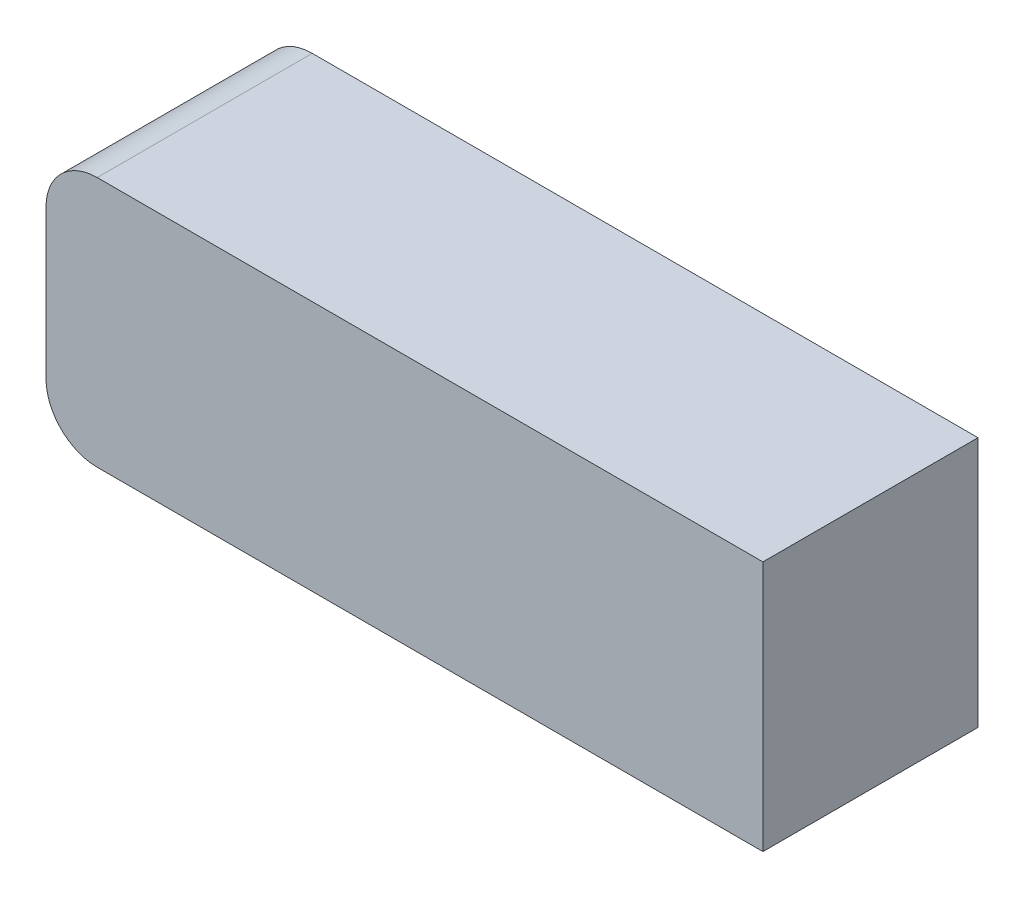
ISO-10303-21;
HEADER;
FILE_DESCRIPTION(('STEP AP214'),'2;1');
FILE_NAME('part.step','',(''),(''),'','','');
FILE_SCHEMA(('AUTOMOTIVE_DESIGN { 1 0 10303 214 1 1 1 1 }'));
ENDSEC;
DATA;
#1=APPLICATION_CONTEXT('core data for automotive mechanical design processes');
#2=APPLICATION_PROTOCOL_DEFINITION('international standard','automotive_design',2000,#1);
#3=PRODUCT_CONTEXT('',#1,'mechanical');
#4=PRODUCT('Part','Part','',(#3));
#5=PRODUCT_RELATED_PRODUCT_CATEGORY('part','',(#4));
#6=PRODUCT_DEFINITION_FORMATION('','',#4);
#7=PRODUCT_DEFINITION_CONTEXT('part definition',#1,'design');
#8=PRODUCT_DEFINITION('design','',#6,#7);
#9=PRODUCT_DEFINITION_SHAPE('','',#8);
#10=(LENGTH_UNIT() NAMED_UNIT(*) SI_UNIT(.MILLI.,.METRE.));
#11=(NAMED_UNIT(*) PLANE_ANGLE_UNIT() SI_UNIT($,.RADIAN.));
#12=(NAMED_UNIT(*) SI_UNIT($,.STERADIAN.) SOLID_ANGLE_UNIT());
#13=UNCERTAINTY_MEASURE_WITH_UNIT(LENGTH_MEASURE(1.E-05),#10,'distance_accuracy_value','');
#14=(GEOMETRIC_REPRESENTATION_CONTEXT(3) GLOBAL_UNCERTAINTY_ASSIGNED_CONTEXT((#13)) GLOBAL_UNIT_ASSIGNED_CONTEXT((#10,
#11,#12)) REPRESENTATION_CONTEXT('',''));
#15=CARTESIAN_POINT('',(0.,0.,0.));
#16=DIRECTION('',(0.,0.,1.));
#17=DIRECTION('',(1.,0.,0.));
#18=AXIS2_PLACEMENT_3D('',#15,#16,#17);
#19=CARTESIAN_POINT('',(-70.0000000000001,24.5,21.));
#20=DIRECTION('',(1.,0.,0.));
#21=DIRECTION('',(0.,0.,-1.));
#22=AXIS2_PLACEMENT_3D('',#19,#20,#21);
#23=PLANE('',#22);
#24=DIRECTION('',(0.,-1.,0.));
#25=VECTOR('',#24,1.);
#26=CARTESIAN_POINT('',(-70.0000000000001,24.5,-21.));
#27=LINE('',#26,#25);
#28=CARTESIAN_POINT('',(-70.0000000000001,14.5,-21.));
#29=VERTEX_POINT('',#28);
#30=CARTESIAN_POINT('',(-70.0000000000001,-14.5,-21.));
#31=VERTEX_POINT('',#30);
#32=EDGE_CURVE('E131',#29,#31,#27,.T.);
#33=ORIENTED_EDGE('',*,*,#32,.T.);
#34=DIRECTION('',(0.,0.,1.));
#35=VECTOR('',#34,1.);
#36=CARTESIAN_POINT('',(-70.0000000000001,-14.5,21.));
#37=LINE('',#36,#35);
#38=CARTESIAN_POINT('',(-70.0000000000001,-14.5,21.));
#39=VERTEX_POINT('',#38);
#40=EDGE_CURVE('E155',#31,#39,#37,.T.);
#41=ORIENTED_EDGE('',*,*,#40,.T.);
#42=DIRECTION('',(0.,-1.,0.));
#43=VECTOR('',#42,1.);
#44=CARTESIAN_POINT('',(-70.0000000000001,24.5,21.));
#45=LINE('',#44,#43);
#46=CARTESIAN_POINT('',(-70.0000000000001,14.5,21.));
#47=VERTEX_POINT('',#46);
#48=EDGE_CURVE('E123',#47,#39,#45,.T.);
#49=ORIENTED_EDGE('',*,*,#48,.F.);
#50=DIRECTION('',(0.,0.,1.));
#51=VECTOR('',#50,1.);
#52=CARTESIAN_POINT('',(-70.0000000000001,14.5,-21.));
#53=LINE('',#52,#51);
#54=EDGE_CURVE('E149',#47,#29,#53,.F.);
#55=ORIENTED_EDGE('',*,*,#54,.T.);
#56=EDGE_LOOP('',(#33,#41,#49,#55));
#57=FACE_BOUND('',#56,.T.);
#58=ADVANCED_FACE('F50',(#57),#23,.F.);
#59=CARTESIAN_POINT('',(70.,24.5,21.));
#60=DIRECTION('',(0.,0.,-1.));
#61=DIRECTION('',(-1.,0.,0.));
#62=AXIS2_PLACEMENT_3D('',#59,#60,#61);
#63=PLANE('',#62);
#64=ORIENTED_EDGE('',*,*,#48,.T.);
#65=CARTESIAN_POINT('',(-60.0000000000001,-14.5,21.));
#66=DIRECTION('',(0.,0.,-1.));
#67=DIRECTION('',(-1.,0.,0.));
#68=AXIS2_PLACEMENT_3D('',#65,#66,#67);
#69=CIRCLE('',#68,10.);
#70=CARTESIAN_POINT('',(-60.0000000000001,-24.5,21.));
#71=VERTEX_POINT('',#70);
#72=EDGE_CURVE('E157',#39,#71,#69,.F.);
#73=ORIENTED_EDGE('',*,*,#72,.T.);
#74=DIRECTION('',(1.,0.,0.));
#75=VECTOR('',#74,1.);
#76=CARTESIAN_POINT('',(70.,-24.5,21.));
#77=LINE('',#76,#75);
#78=CARTESIAN_POINT('',(70.,-24.5,21.));
#79=VERTEX_POINT('',#78);
#80=EDGE_CURVE('E118',#71,#79,#77,.T.);
#81=ORIENTED_EDGE('',*,*,#80,.T.);
#82=DIRECTION('',(0.,-1.,0.));
#83=VECTOR('',#82,1.);
#84=CARTESIAN_POINT('',(70.,24.5,21.));
#85=LINE('',#84,#83);
#86=CARTESIAN_POINT('',(70.,24.5,21.));
#87=VERTEX_POINT('',#86);
#88=EDGE_CURVE('E119',#87,#79,#85,.T.);
#89=ORIENTED_EDGE('',*,*,#88,.F.);
#90=DIRECTION('',(1.,0.,0.));
#91=VECTOR('',#90,1.);
#92=CARTESIAN_POINT('',(70.,24.5,21.));
#93=LINE('',#92,#91);
#94=CARTESIAN_POINT('',(-60.0000000000001,24.5,21.));
#95=VERTEX_POINT('',#94);
#96=EDGE_CURVE('E102',#95,#87,#93,.T.);
#97=ORIENTED_EDGE('',*,*,#96,.F.);
#98=CARTESIAN_POINT('',(-60.0000000000001,14.5,21.));
#99=DIRECTION('',(0.,0.,-1.));
#100=DIRECTION('',(-1.,0.,0.));
#101=AXIS2_PLACEMENT_3D('',#98,#99,#100);
#102=CIRCLE('',#101,10.);
#103=EDGE_CURVE('E156',#95,#47,#102,.F.);
#104=ORIENTED_EDGE('',*,*,#103,.T.);
#105=EDGE_LOOP('',(#64,#73,#81,#89,#97,#104));
#106=FACE_BOUND('',#105,.T.);
#107=ADVANCED_FACE('F120',(#106),#63,.F.);
#108=CARTESIAN_POINT('',(70.,24.5,21.));
#109=DIRECTION('',(-1.,0.,0.));
#110=DIRECTION('',(0.,0.,1.));
#111=AXIS2_PLACEMENT_3D('',#108,#109,#110);
#112=PLANE('',#111);
#113=DIRECTION('',(0.,0.,-1.));
#114=VECTOR('',#113,1.);
#115=CARTESIAN_POINT('',(70.,-24.5,21.));
#116=LINE('',#115,#114);
#117=CARTESIAN_POINT('',(70.,-24.5,-21.));
#118=VERTEX_POINT('',#117);
#119=EDGE_CURVE('E140',#79,#118,#116,.T.);
#120=ORIENTED_EDGE('',*,*,#119,.T.);
#121=DIRECTION('',(0.,-1.,0.));
#122=VECTOR('',#121,1.);
#123=CARTESIAN_POINT('',(70.,24.5,-21.));
#124=LINE('',#123,#122);
#125=CARTESIAN_POINT('',(70.,24.5,-21.));
#126=VERTEX_POINT('',#125);
#127=EDGE_CURVE('E122',#126,#118,#124,.T.);
#128=ORIENTED_EDGE('',*,*,#127,.F.);
#129=DIRECTION('',(0.,0.,-1.));
#130=VECTOR('',#129,1.);
#131=CARTESIAN_POINT('',(70.,24.5,21.));
#132=LINE('',#131,#130);
#133=EDGE_CURVE('E107',#87,#126,#132,.T.);
#134=ORIENTED_EDGE('',*,*,#133,.F.);
#135=ORIENTED_EDGE('',*,*,#88,.T.);
#136=EDGE_LOOP('',(#120,#128,#134,#135));
#137=FACE_BOUND('',#136,.T.);
#138=ADVANCED_FACE('F127',(#137),#112,.F.);
#139=CARTESIAN_POINT('',(70.,24.5,-21.));
#140=DIRECTION('',(0.,0.,1.));
#141=DIRECTION('',(1.,0.,0.));
#142=AXIS2_PLACEMENT_3D('',#139,#140,#141);
#143=PLANE('',#142);
#144=DIRECTION('',(-1.,0.,0.));
#145=VECTOR('',#144,1.);
#146=CARTESIAN_POINT('',(70.,-24.5,-21.));
#147=LINE('',#146,#145);
#148=CARTESIAN_POINT('',(-60.0000000000001,-24.5,-21.));
#149=VERTEX_POINT('',#148);
#150=EDGE_CURVE('E114',#118,#149,#147,.T.);
#151=ORIENTED_EDGE('',*,*,#150,.T.);
#152=CARTESIAN_POINT('',(-60.0000000000001,-14.5,-21.));
#153=DIRECTION('',(0.,0.,1.));
#154=DIRECTION('',(1.,0.,0.));
#155=AXIS2_PLACEMENT_3D('',#152,#153,#154);
#156=CIRCLE('',#155,10.);
#157=EDGE_CURVE('E57',#149,#31,#156,.F.);
#158=ORIENTED_EDGE('',*,*,#157,.T.);
#159=ORIENTED_EDGE('',*,*,#32,.F.);
#160=CARTESIAN_POINT('',(-60.0000000000001,14.5,-21.));
#161=DIRECTION('',(0.,0.,1.));
#162=DIRECTION('',(1.,0.,0.));
#163=AXIS2_PLACEMENT_3D('',#160,#161,#162);
#164=CIRCLE('',#163,10.);
#165=CARTESIAN_POINT('',(-60.0000000000001,24.5,-21.));
#166=VERTEX_POINT('',#165);
#167=EDGE_CURVE('E65',#29,#166,#164,.F.);
#168=ORIENTED_EDGE('',*,*,#167,.T.);
#169=DIRECTION('',(-1.,0.,0.));
#170=VECTOR('',#169,1.);
#171=CARTESIAN_POINT('',(70.,24.5,-21.));
#172=LINE('',#171,#170);
#173=EDGE_CURVE('E129',#126,#166,#172,.T.);
#174=ORIENTED_EDGE('',*,*,#173,.F.);
#175=ORIENTED_EDGE('',*,*,#127,.T.);
#176=EDGE_LOOP('',(#151,#158,#159,#168,#174,#175));
#177=FACE_BOUND('',#176,.T.);
#178=ADVANCED_FACE('F170',(#177),#143,.F.);
#179=CARTESIAN_POINT('',(0.,24.5,0.));
#180=DIRECTION('',(0.,1.,0.));
#181=DIRECTION('',(0.,0.,1.));
#182=AXIS2_PLACEMENT_3D('',#179,#180,#181);
#183=PLANE('',#182);
#184=ORIENTED_EDGE('',*,*,#173,.T.);
#185=DIRECTION('',(0.,0.,1.));
#186=VECTOR('',#185,1.);
#187=CARTESIAN_POINT('',(-60.0000000000001,24.5,21.));
#188=LINE('',#187,#186);
#189=EDGE_CURVE('E11',#166,#95,#188,.T.);
#190=ORIENTED_EDGE('',*,*,#189,.T.);
#191=ORIENTED_EDGE('',*,*,#96,.T.);
#192=ORIENTED_EDGE('',*,*,#133,.T.);
#193=EDGE_LOOP('',(#184,#190,#191,#192));
#194=FACE_BOUND('',#193,.T.);
#195=ADVANCED_FACE('F106',(#194),#183,.T.);
#196=CARTESIAN_POINT('',(0.,-24.5,0.));
#197=DIRECTION('',(0.,1.,0.));
#198=DIRECTION('',(0.,0.,1.));
#199=AXIS2_PLACEMENT_3D('',#196,#197,#198);
#200=PLANE('',#199);
#201=ORIENTED_EDGE('',*,*,#80,.F.);
#202=DIRECTION('',(0.,0.,1.));
#203=VECTOR('',#202,1.);
#204=CARTESIAN_POINT('',(-60.0000000000001,-24.5,0.));
#205=LINE('',#204,#203);
#206=EDGE_CURVE('E72',#71,#149,#205,.F.);
#207=ORIENTED_EDGE('',*,*,#206,.T.);
#208=ORIENTED_EDGE('',*,*,#150,.F.);
#209=ORIENTED_EDGE('',*,*,#119,.F.);
#210=EDGE_LOOP('',(#201,#207,#208,#209));
#211=FACE_BOUND('',#210,.T.);
#212=ADVANCED_FACE('F173',(#211),#200,.F.);
#213=CARTESIAN_POINT('',(-60.0000000000001,-14.5,21.));
#214=DIRECTION('',(0.,0.,1.));
#215=DIRECTION('',(1.,0.,0.));
#216=AXIS2_PLACEMENT_3D('',#213,#214,#215);
#217=CYLINDRICAL_SURFACE('',#216,10.);
#218=ORIENTED_EDGE('',*,*,#157,.F.);
#219=ORIENTED_EDGE('',*,*,#206,.F.);
#220=ORIENTED_EDGE('',*,*,#72,.F.);
#221=ORIENTED_EDGE('',*,*,#40,.F.);
#222=EDGE_LOOP('',(#218,#219,#220,#221));
#223=FACE_BOUND('',#222,.T.);
#224=ADVANCED_FACE('F175',(#223),#217,.T.);
#225=CARTESIAN_POINT('',(-60.0000000000001,14.5,0.));
#226=DIRECTION('',(0.,0.,-1.));
#227=DIRECTION('',(-1.,0.,0.));
#228=AXIS2_PLACEMENT_3D('',#225,#226,#227);
#229=CYLINDRICAL_SURFACE('',#228,10.);
#230=ORIENTED_EDGE('',*,*,#167,.F.);
#231=ORIENTED_EDGE('',*,*,#54,.F.);
#232=ORIENTED_EDGE('',*,*,#103,.F.);
#233=ORIENTED_EDGE('',*,*,#189,.F.);
#234=EDGE_LOOP('',(#230,#231,#232,#233));
#235=FACE_BOUND('',#234,.T.);
#236=ADVANCED_FACE('F47',(#235),#229,.T.);
#237=CLOSED_SHELL('',(#58,#107,#138,#178,#195,#212,#224,#236));
#238=MANIFOLD_SOLID_BREP('B2',#237);
#239=ADVANCED_BREP_SHAPE_REPRESENTATION('',(#18,#238),#14);
#240=SHAPE_DEFINITION_REPRESENTATION(#9,#239);
ENDSEC;
END-ISO-10303-21;
